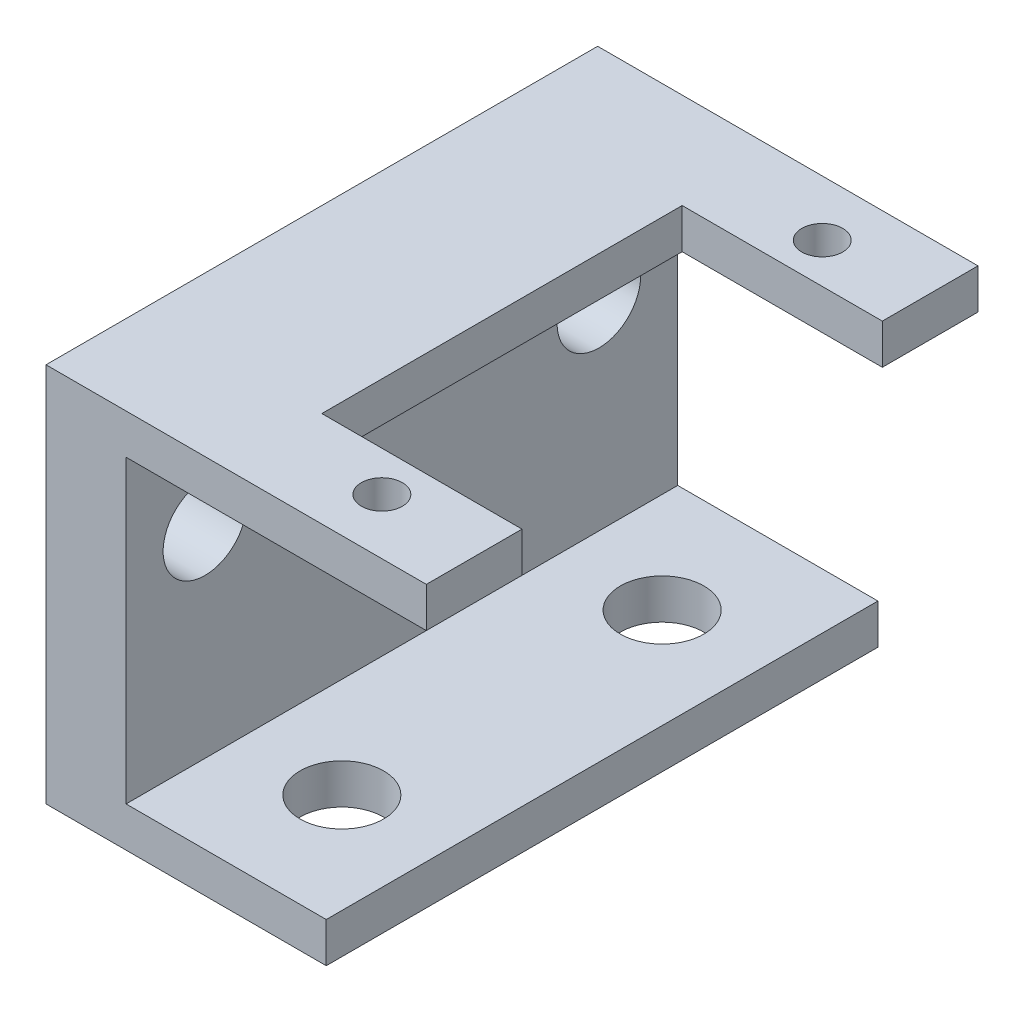
ISO-10303-21;
HEADER;
FILE_DESCRIPTION(('STEP AP214'),'2;1');
FILE_NAME('part.step','',(''),(''),'','','');
FILE_SCHEMA(('AUTOMOTIVE_DESIGN { 1 0 10303 214 1 1 1 1 }'));
ENDSEC;
DATA;
#1=APPLICATION_CONTEXT('core data for automotive mechanical design processes');
#2=APPLICATION_PROTOCOL_DEFINITION('international standard','automotive_design',2000,#1);
#3=PRODUCT_CONTEXT('',#1,'mechanical');
#4=PRODUCT('Part','Part','',(#3));
#5=PRODUCT_RELATED_PRODUCT_CATEGORY('part','',(#4));
#6=PRODUCT_DEFINITION_FORMATION('','',#4);
#7=PRODUCT_DEFINITION_CONTEXT('part definition',#1,'design');
#8=PRODUCT_DEFINITION('design','',#6,#7);
#9=PRODUCT_DEFINITION_SHAPE('','',#8);
#10=(LENGTH_UNIT() NAMED_UNIT(*) SI_UNIT(.MILLI.,.METRE.));
#11=(NAMED_UNIT(*) PLANE_ANGLE_UNIT() SI_UNIT($,.RADIAN.));
#12=(NAMED_UNIT(*) SI_UNIT($,.STERADIAN.) SOLID_ANGLE_UNIT());
#13=UNCERTAINTY_MEASURE_WITH_UNIT(LENGTH_MEASURE(1.E-05),#10,'distance_accuracy_value','');
#14=(GEOMETRIC_REPRESENTATION_CONTEXT(3) GLOBAL_UNCERTAINTY_ASSIGNED_CONTEXT((#13)) GLOBAL_UNIT_ASSIGNED_CONTEXT((#10,
#11,#12)) REPRESENTATION_CONTEXT('',''));
#15=CARTESIAN_POINT('',(0.,0.,0.));
#16=DIRECTION('',(0.,0.,1.));
#17=DIRECTION('',(1.,0.,0.));
#18=AXIS2_PLACEMENT_3D('',#15,#16,#17);
#19=CARTESIAN_POINT('',(24.13,0.,35.));
#20=DIRECTION('',(-1.,0.,0.));
#21=DIRECTION('',(0.,0.,1.));
#22=AXIS2_PLACEMENT_3D('',#19,#20,#21);
#23=PLANE('',#22);
#24=DIRECTION('',(0.,1.,0.));
#25=VECTOR('',#24,1.);
#26=CARTESIAN_POINT('',(24.13,-0.001000000000001,28.93));
#27=LINE('',#26,#25);
#28=CARTESIAN_POINT('',(24.13,21.59,28.93));
#29=VERTEX_POINT('',#28);
#30=CARTESIAN_POINT('',(24.13,24.13,28.93));
#31=VERTEX_POINT('',#30);
#32=EDGE_CURVE('E51',#29,#31,#27,.T.);
#33=ORIENTED_EDGE('',*,*,#32,.T.);
#34=DIRECTION('',(0.,0.,-1.));
#35=VECTOR('',#34,1.);
#36=CARTESIAN_POINT('',(24.13,24.13,35.));
#37=LINE('',#36,#35);
#38=CARTESIAN_POINT('',(24.13,24.13,35.));
#39=VERTEX_POINT('',#38);
#40=EDGE_CURVE('E171',#39,#31,#37,.T.);
#41=ORIENTED_EDGE('',*,*,#40,.F.);
#42=DIRECTION('',(0.,1.,0.));
#43=VECTOR('',#42,1.);
#44=CARTESIAN_POINT('',(24.13,0.,35.));
#45=LINE('',#44,#43);
#46=CARTESIAN_POINT('',(24.13,21.59,35.));
#47=VERTEX_POINT('',#46);
#48=EDGE_CURVE('E153',#47,#39,#45,.T.);
#49=ORIENTED_EDGE('',*,*,#48,.F.);
#50=DIRECTION('',(0.,0.,-1.));
#51=VECTOR('',#50,1.);
#52=CARTESIAN_POINT('',(24.13,21.59,35.));
#53=LINE('',#52,#51);
#54=EDGE_CURVE('E43',#47,#29,#53,.T.);
#55=ORIENTED_EDGE('',*,*,#54,.T.);
#56=EDGE_LOOP('',(#33,#41,#49,#55));
#57=FACE_BOUND('',#56,.T.);
#58=ADVANCED_FACE('F34',(#57),#23,.F.);
#59=CARTESIAN_POINT('',(0.,24.13,35.));
#60=DIRECTION('',(0.,1.,0.));
#61=DIRECTION('',(0.,0.,1.));
#62=AXIS2_PLACEMENT_3D('',#59,#60,#61);
#63=PLANE('',#62);
#64=CARTESIAN_POINT('',(17.78,24.13,31.47));
#65=DIRECTION('',(0.,1.,0.));
#66=DIRECTION('',(0.,0.,1.));
#67=AXIS2_PLACEMENT_3D('',#64,#65,#66);
#68=CIRCLE('',#67,1.3);
#69=CARTESIAN_POINT('',(17.78,24.13,32.77));
#70=VERTEX_POINT('',#69);
#71=EDGE_CURVE('E373',#70,#70,#68,.T.);
#72=ORIENTED_EDGE('',*,*,#71,.F.);
#73=EDGE_LOOP('',(#72));
#74=FACE_BOUND('',#73,.T.);
#75=CARTESIAN_POINT('',(17.78,24.13,3.53));
#76=DIRECTION('',(0.,1.,0.));
#77=DIRECTION('',(0.,0.,1.));
#78=AXIS2_PLACEMENT_3D('',#75,#76,#77);
#79=CIRCLE('',#78,1.3);
#80=CARTESIAN_POINT('',(17.78,24.13,4.83));
#81=VERTEX_POINT('',#80);
#82=EDGE_CURVE('E242',#81,#81,#79,.T.);
#83=ORIENTED_EDGE('',*,*,#82,.F.);
#84=EDGE_LOOP('',(#83));
#85=FACE_BOUND('',#84,.T.);
#86=DIRECTION('',(-1.,0.,0.));
#87=VECTOR('',#86,1.);
#88=CARTESIAN_POINT('',(24.13,24.13,6.07));
#89=LINE('',#88,#87);
#90=CARTESIAN_POINT('',(24.13,24.13,6.07));
#91=VERTEX_POINT('',#90);
#92=CARTESIAN_POINT('',(11.43,24.13,6.07));
#93=VERTEX_POINT('',#92);
#94=EDGE_CURVE('E235',#91,#93,#89,.T.);
#95=ORIENTED_EDGE('',*,*,#94,.F.);
#96=CARTESIAN_POINT('',(24.13,24.13,0.));
#97=VERTEX_POINT('',#96);
#98=EDGE_CURVE('E170',#91,#97,#37,.T.);
#99=ORIENTED_EDGE('',*,*,#98,.T.);
#100=DIRECTION('',(1.,0.,0.));
#101=VECTOR('',#100,1.);
#102=CARTESIAN_POINT('',(0.,24.13,0.));
#103=LINE('',#102,#101);
#104=CARTESIAN_POINT('',(0.,24.13,0.));
#105=VERTEX_POINT('',#104);
#106=EDGE_CURVE('E106',#105,#97,#103,.T.);
#107=ORIENTED_EDGE('',*,*,#106,.F.);
#108=DIRECTION('',(0.,0.,-1.));
#109=VECTOR('',#108,1.);
#110=CARTESIAN_POINT('',(0.,24.13,35.));
#111=LINE('',#110,#109);
#112=CARTESIAN_POINT('',(0.,24.13,35.));
#113=VERTEX_POINT('',#112);
#114=EDGE_CURVE('E100',#113,#105,#111,.T.);
#115=ORIENTED_EDGE('',*,*,#114,.F.);
#116=DIRECTION('',(1.,0.,0.));
#117=VECTOR('',#116,1.);
#118=CARTESIAN_POINT('',(0.,24.13,35.));
#119=LINE('',#118,#117);
#120=EDGE_CURVE('E156',#113,#39,#119,.T.);
#121=ORIENTED_EDGE('',*,*,#120,.T.);
#122=ORIENTED_EDGE('',*,*,#40,.T.);
#123=DIRECTION('',(-1.,0.,0.));
#124=VECTOR('',#123,1.);
#125=CARTESIAN_POINT('',(24.13,24.13,28.93));
#126=LINE('',#125,#124);
#127=CARTESIAN_POINT('',(11.43,24.13,28.93));
#128=VERTEX_POINT('',#127);
#129=EDGE_CURVE('E247',#31,#128,#126,.T.);
#130=ORIENTED_EDGE('',*,*,#129,.T.);
#131=DIRECTION('',(0.,0.,1.));
#132=VECTOR('',#131,1.);
#133=CARTESIAN_POINT('',(11.43,24.13,6.07));
#134=LINE('',#133,#132);
#135=EDGE_CURVE('E250',#93,#128,#134,.T.);
#136=ORIENTED_EDGE('',*,*,#135,.F.);
#137=EDGE_LOOP('',(#95,#99,#107,#115,#121,#122,#130,#136));
#138=FACE_BOUND('',#137,.T.);
#139=ADVANCED_FACE('F296',(#74,#85,#138),#63,.T.);
#140=ORIENTED_EDGE('',*,*,#98,.F.);
#141=DIRECTION('',(0.,1.,0.));
#142=VECTOR('',#141,1.);
#143=CARTESIAN_POINT('',(24.13,-0.001000000000001,6.07));
#144=LINE('',#143,#142);
#145=CARTESIAN_POINT('',(24.13,21.59,6.07));
#146=VERTEX_POINT('',#145);
#147=EDGE_CURVE('E237',#146,#91,#144,.T.);
#148=ORIENTED_EDGE('',*,*,#147,.F.);
#149=CARTESIAN_POINT('',(24.13,21.59,0.));
#150=VERTEX_POINT('',#149);
#151=EDGE_CURVE('E174',#146,#150,#53,.T.);
#152=ORIENTED_EDGE('',*,*,#151,.T.);
#153=DIRECTION('',(0.,1.,0.));
#154=VECTOR('',#153,1.);
#155=CARTESIAN_POINT('',(24.13,0.,0.));
#156=LINE('',#155,#154);
#157=EDGE_CURVE('E164',#150,#97,#156,.T.);
#158=ORIENTED_EDGE('',*,*,#157,.T.);
#159=EDGE_LOOP('',(#140,#148,#152,#158));
#160=FACE_BOUND('',#159,.T.);
#161=ADVANCED_FACE('F299',(#160),#23,.F.);
#162=CARTESIAN_POINT('',(0.,0.,0.));
#163=DIRECTION('',(0.,0.,1.));
#164=DIRECTION('',(1.,0.,0.));
#165=AXIS2_PLACEMENT_3D('',#162,#163,#164);
#166=PLANE('',#165);
#167=DIRECTION('',(1.,0.,0.));
#168=VECTOR('',#167,1.);
#169=CARTESIAN_POINT('',(0.,21.59,0.));
#170=LINE('',#169,#168);
#171=CARTESIAN_POINT('',(5.08,21.59,0.));
#172=VERTEX_POINT('',#171);
#173=EDGE_CURVE('E161',#172,#150,#170,.T.);
#174=ORIENTED_EDGE('',*,*,#173,.F.);
#175=DIRECTION('',(0.,1.,0.));
#176=VECTOR('',#175,1.);
#177=CARTESIAN_POINT('',(5.08,2.54,0.));
#178=LINE('',#177,#176);
#179=CARTESIAN_POINT('',(5.08,2.54,0.));
#180=VERTEX_POINT('',#179);
#181=EDGE_CURVE('E114',#180,#172,#178,.T.);
#182=ORIENTED_EDGE('',*,*,#181,.F.);
#183=DIRECTION('',(1.,0.,0.));
#184=VECTOR('',#183,1.);
#185=CARTESIAN_POINT('',(0.,2.54,0.));
#186=LINE('',#185,#184);
#187=CARTESIAN_POINT('',(17.78,2.54,0.));
#188=VERTEX_POINT('',#187);
#189=EDGE_CURVE('E126',#180,#188,#186,.T.);
#190=ORIENTED_EDGE('',*,*,#189,.T.);
#191=DIRECTION('',(0.,1.,0.));
#192=VECTOR('',#191,1.);
#193=CARTESIAN_POINT('',(17.78,0.,0.));
#194=LINE('',#193,#192);
#195=CARTESIAN_POINT('',(17.78,0.,0.));
#196=VERTEX_POINT('',#195);
#197=EDGE_CURVE('E121',#196,#188,#194,.T.);
#198=ORIENTED_EDGE('',*,*,#197,.F.);
#199=DIRECTION('',(1.,0.,0.));
#200=VECTOR('',#199,1.);
#201=CARTESIAN_POINT('',(0.,0.,0.));
#202=LINE('',#201,#200);
#203=CARTESIAN_POINT('',(0.,0.,0.));
#204=VERTEX_POINT('',#203);
#205=EDGE_CURVE('E111',#204,#196,#202,.T.);
#206=ORIENTED_EDGE('',*,*,#205,.F.);
#207=DIRECTION('',(0.,1.,0.));
#208=VECTOR('',#207,1.);
#209=CARTESIAN_POINT('',(0.,0.,0.));
#210=LINE('',#209,#208);
#211=EDGE_CURVE('E92',#204,#105,#210,.T.);
#212=ORIENTED_EDGE('',*,*,#211,.T.);
#213=ORIENTED_EDGE('',*,*,#106,.T.);
#214=ORIENTED_EDGE('',*,*,#157,.F.);
#215=EDGE_LOOP('',(#174,#182,#190,#198,#206,#212,#213,#214));
#216=FACE_BOUND('',#215,.T.);
#217=ADVANCED_FACE('F119',(#216),#166,.F.);
#218=CARTESIAN_POINT('',(0.,0.,35.));
#219=DIRECTION('',(0.,0.,1.));
#220=DIRECTION('',(1.,0.,0.));
#221=AXIS2_PLACEMENT_3D('',#218,#219,#220);
#222=PLANE('',#221);
#223=DIRECTION('',(0.,1.,0.));
#224=VECTOR('',#223,1.);
#225=CARTESIAN_POINT('',(0.,0.,35.));
#226=LINE('',#225,#224);
#227=CARTESIAN_POINT('',(0.,0.,35.));
#228=VERTEX_POINT('',#227);
#229=EDGE_CURVE('E159',#228,#113,#226,.T.);
#230=ORIENTED_EDGE('',*,*,#229,.F.);
#231=DIRECTION('',(1.,0.,0.));
#232=VECTOR('',#231,1.);
#233=CARTESIAN_POINT('',(0.,0.,35.));
#234=LINE('',#233,#232);
#235=CARTESIAN_POINT('',(17.78,0.,35.));
#236=VERTEX_POINT('',#235);
#237=EDGE_CURVE('E113',#228,#236,#234,.T.);
#238=ORIENTED_EDGE('',*,*,#237,.T.);
#239=DIRECTION('',(0.,1.,0.));
#240=VECTOR('',#239,1.);
#241=CARTESIAN_POINT('',(17.78,0.,35.));
#242=LINE('',#241,#240);
#243=CARTESIAN_POINT('',(17.78,2.54,35.));
#244=VERTEX_POINT('',#243);
#245=EDGE_CURVE('E124',#236,#244,#242,.T.);
#246=ORIENTED_EDGE('',*,*,#245,.T.);
#247=DIRECTION('',(1.,0.,0.));
#248=VECTOR('',#247,1.);
#249=CARTESIAN_POINT('',(0.,2.54,35.));
#250=LINE('',#249,#248);
#251=CARTESIAN_POINT('',(5.08,2.54,35.));
#252=VERTEX_POINT('',#251);
#253=EDGE_CURVE('E122',#252,#244,#250,.T.);
#254=ORIENTED_EDGE('',*,*,#253,.F.);
#255=DIRECTION('',(0.,1.,0.));
#256=VECTOR('',#255,1.);
#257=CARTESIAN_POINT('',(5.08,2.54,35.));
#258=LINE('',#257,#256);
#259=CARTESIAN_POINT('',(5.08,21.59,35.));
#260=VERTEX_POINT('',#259);
#261=EDGE_CURVE('E177',#252,#260,#258,.T.);
#262=ORIENTED_EDGE('',*,*,#261,.T.);
#263=DIRECTION('',(1.,0.,0.));
#264=VECTOR('',#263,1.);
#265=CARTESIAN_POINT('',(0.,21.59,35.));
#266=LINE('',#265,#264);
#267=EDGE_CURVE('E105',#260,#47,#266,.T.);
#268=ORIENTED_EDGE('',*,*,#267,.T.);
#269=ORIENTED_EDGE('',*,*,#48,.T.);
#270=ORIENTED_EDGE('',*,*,#120,.F.);
#271=EDGE_LOOP('',(#230,#238,#246,#254,#262,#268,#269,#270));
#272=FACE_BOUND('',#271,.T.);
#273=ADVANCED_FACE('F310',(#272),#222,.T.);
#274=CARTESIAN_POINT('',(0.,21.59,35.));
#275=DIRECTION('',(0.,1.,0.));
#276=DIRECTION('',(0.,0.,1.));
#277=AXIS2_PLACEMENT_3D('',#274,#275,#276);
#278=PLANE('',#277);
#279=CARTESIAN_POINT('',(17.78,21.59,31.47));
#280=DIRECTION('',(0.,1.,0.));
#281=DIRECTION('',(0.,0.,1.));
#282=AXIS2_PLACEMENT_3D('',#279,#280,#281);
#283=CIRCLE('',#282,1.3);
#284=CARTESIAN_POINT('',(17.78,21.59,32.77));
#285=VERTEX_POINT('',#284);
#286=EDGE_CURVE('E370',#285,#285,#283,.T.);
#287=ORIENTED_EDGE('',*,*,#286,.T.);
#288=EDGE_LOOP('',(#287));
#289=FACE_BOUND('',#288,.T.);
#290=CARTESIAN_POINT('',(17.78,21.59,3.53));
#291=DIRECTION('',(0.,1.,0.));
#292=DIRECTION('',(0.,0.,1.));
#293=AXIS2_PLACEMENT_3D('',#290,#291,#292);
#294=CIRCLE('',#293,1.3);
#295=CARTESIAN_POINT('',(17.78,21.59,4.83));
#296=VERTEX_POINT('',#295);
#297=EDGE_CURVE('E239',#296,#296,#294,.T.);
#298=ORIENTED_EDGE('',*,*,#297,.T.);
#299=EDGE_LOOP('',(#298));
#300=FACE_BOUND('',#299,.T.);
#301=ORIENTED_EDGE('',*,*,#151,.F.);
#302=DIRECTION('',(1.,0.,0.));
#303=VECTOR('',#302,1.);
#304=CARTESIAN_POINT('',(24.13,21.59,6.07));
#305=LINE('',#304,#303);
#306=CARTESIAN_POINT('',(11.43,21.59,6.07));
#307=VERTEX_POINT('',#306);
#308=EDGE_CURVE('E230',#307,#146,#305,.T.);
#309=ORIENTED_EDGE('',*,*,#308,.F.);
#310=DIRECTION('',(0.,0.,-1.));
#311=VECTOR('',#310,1.);
#312=CARTESIAN_POINT('',(11.43,21.59,6.07));
#313=LINE('',#312,#311);
#314=CARTESIAN_POINT('',(11.43,21.59,28.93));
#315=VERTEX_POINT('',#314);
#316=EDGE_CURVE('E222',#315,#307,#313,.T.);
#317=ORIENTED_EDGE('',*,*,#316,.F.);
#318=DIRECTION('',(1.,0.,0.));
#319=VECTOR('',#318,1.);
#320=CARTESIAN_POINT('',(24.13,21.59,28.93));
#321=LINE('',#320,#319);
#322=EDGE_CURVE('E229',#315,#29,#321,.T.);
#323=ORIENTED_EDGE('',*,*,#322,.T.);
#324=ORIENTED_EDGE('',*,*,#54,.F.);
#325=ORIENTED_EDGE('',*,*,#267,.F.);
#326=DIRECTION('',(0.,0.,-1.));
#327=VECTOR('',#326,1.);
#328=CARTESIAN_POINT('',(5.08,21.59,35.));
#329=LINE('',#328,#327);
#330=EDGE_CURVE('E11',#260,#172,#329,.T.);
#331=ORIENTED_EDGE('',*,*,#330,.T.);
#332=ORIENTED_EDGE('',*,*,#173,.T.);
#333=EDGE_LOOP('',(#301,#309,#317,#323,#324,#325,#331,#332));
#334=FACE_BOUND('',#333,.T.);
#335=ADVANCED_FACE('F185',(#289,#300,#334),#278,.F.);
#336=CARTESIAN_POINT('',(0.,0.,35.));
#337=DIRECTION('',(-1.,0.,0.));
#338=DIRECTION('',(0.,-1.,0.));
#339=AXIS2_PLACEMENT_3D('',#336,#337,#338);
#340=PLANE('',#339);
#341=CARTESIAN_POINT('',(0.,15.24,30.));
#342=DIRECTION('',(1.,0.,0.));
#343=DIRECTION('',(0.,0.,-1.));
#344=AXIS2_PLACEMENT_3D('',#341,#342,#343);
#345=CIRCLE('',#344,2.65);
#346=CARTESIAN_POINT('',(0.,15.24,27.35));
#347=VERTEX_POINT('',#346);
#348=EDGE_CURVE('E147',#347,#347,#345,.T.);
#349=ORIENTED_EDGE('',*,*,#348,.T.);
#350=EDGE_LOOP('',(#349));
#351=FACE_BOUND('',#350,.T.);
#352=CARTESIAN_POINT('',(0.,15.24,5.));
#353=DIRECTION('',(1.,0.,0.));
#354=DIRECTION('',(0.,0.,-1.));
#355=AXIS2_PLACEMENT_3D('',#352,#353,#354);
#356=CIRCLE('',#355,2.65);
#357=CARTESIAN_POINT('',(0.,15.24,2.35000000000001));
#358=VERTEX_POINT('',#357);
#359=EDGE_CURVE('E139',#358,#358,#356,.T.);
#360=ORIENTED_EDGE('',*,*,#359,.T.);
#361=EDGE_LOOP('',(#360));
#362=FACE_BOUND('',#361,.T.);
#363=ORIENTED_EDGE('',*,*,#211,.F.);
#364=DIRECTION('',(0.,0.,-1.));
#365=VECTOR('',#364,1.);
#366=CARTESIAN_POINT('',(0.,0.,35.));
#367=LINE('',#366,#365);
#368=EDGE_CURVE('E96',#228,#204,#367,.T.);
#369=ORIENTED_EDGE('',*,*,#368,.F.);
#370=ORIENTED_EDGE('',*,*,#229,.T.);
#371=ORIENTED_EDGE('',*,*,#114,.T.);
#372=EDGE_LOOP('',(#363,#369,#370,#371));
#373=FACE_BOUND('',#372,.T.);
#374=ADVANCED_FACE('F94',(#351,#362,#373),#340,.T.);
#375=CARTESIAN_POINT('',(0.,0.,35.));
#376=DIRECTION('',(0.,1.,0.));
#377=DIRECTION('',(0.,0.,1.));
#378=AXIS2_PLACEMENT_3D('',#375,#376,#377);
#379=PLANE('',#378);
#380=CARTESIAN_POINT('',(11.43,0.,27.66));
#381=DIRECTION('',(0.,1.,0.));
#382=DIRECTION('',(0.,0.,1.));
#383=AXIS2_PLACEMENT_3D('',#380,#381,#382);
#384=CIRCLE('',#383,2.65);
#385=CARTESIAN_POINT('',(11.43,0.,30.31));
#386=VERTEX_POINT('',#385);
#387=EDGE_CURVE('E259',#386,#386,#384,.T.);
#388=ORIENTED_EDGE('',*,*,#387,.T.);
#389=EDGE_LOOP('',(#388));
#390=FACE_BOUND('',#389,.T.);
#391=CARTESIAN_POINT('',(11.43,0.,7.34));
#392=DIRECTION('',(0.,1.,0.));
#393=DIRECTION('',(0.,0.,1.));
#394=AXIS2_PLACEMENT_3D('',#391,#392,#393);
#395=CIRCLE('',#394,2.65);
#396=CARTESIAN_POINT('',(11.43,0.,9.99));
#397=VERTEX_POINT('',#396);
#398=EDGE_CURVE('E265',#397,#397,#395,.T.);
#399=ORIENTED_EDGE('',*,*,#398,.T.);
#400=EDGE_LOOP('',(#399));
#401=FACE_BOUND('',#400,.T.);
#402=ORIENTED_EDGE('',*,*,#205,.T.);
#403=DIRECTION('',(0.,0.,-1.));
#404=VECTOR('',#403,1.);
#405=CARTESIAN_POINT('',(17.78,0.,35.));
#406=LINE('',#405,#404);
#407=EDGE_CURVE('E115',#236,#196,#406,.T.);
#408=ORIENTED_EDGE('',*,*,#407,.F.);
#409=ORIENTED_EDGE('',*,*,#237,.F.);
#410=ORIENTED_EDGE('',*,*,#368,.T.);
#411=EDGE_LOOP('',(#402,#408,#409,#410));
#412=FACE_BOUND('',#411,.T.);
#413=ADVANCED_FACE('F109',(#390,#401,#412),#379,.F.);
#414=CARTESIAN_POINT('',(17.78,0.,35.));
#415=DIRECTION('',(-1.,0.,0.));
#416=DIRECTION('',(0.,0.,1.));
#417=AXIS2_PLACEMENT_3D('',#414,#415,#416);
#418=PLANE('',#417);
#419=ORIENTED_EDGE('',*,*,#197,.T.);
#420=DIRECTION('',(0.,0.,-1.));
#421=VECTOR('',#420,1.);
#422=CARTESIAN_POINT('',(17.78,2.54,35.));
#423=LINE('',#422,#421);
#424=EDGE_CURVE('E38',#244,#188,#423,.T.);
#425=ORIENTED_EDGE('',*,*,#424,.F.);
#426=ORIENTED_EDGE('',*,*,#245,.F.);
#427=ORIENTED_EDGE('',*,*,#407,.T.);
#428=EDGE_LOOP('',(#419,#425,#426,#427));
#429=FACE_BOUND('',#428,.T.);
#430=ADVANCED_FACE('F290',(#429),#418,.F.);
#431=CARTESIAN_POINT('',(0.,2.54,35.));
#432=DIRECTION('',(0.,1.,0.));
#433=DIRECTION('',(0.,0.,1.));
#434=AXIS2_PLACEMENT_3D('',#431,#432,#433);
#435=PLANE('',#434);
#436=CARTESIAN_POINT('',(11.43,2.54,27.66));
#437=DIRECTION('',(0.,1.,0.));
#438=DIRECTION('',(0.,0.,1.));
#439=AXIS2_PLACEMENT_3D('',#436,#437,#438);
#440=CIRCLE('',#439,2.64999999999999);
#441=CARTESIAN_POINT('',(11.43,2.54,30.31));
#442=VERTEX_POINT('',#441);
#443=EDGE_CURVE('E256',#442,#442,#440,.T.);
#444=ORIENTED_EDGE('',*,*,#443,.F.);
#445=EDGE_LOOP('',(#444));
#446=FACE_BOUND('',#445,.T.);
#447=CARTESIAN_POINT('',(11.43,2.54,7.34));
#448=DIRECTION('',(0.,1.,0.));
#449=DIRECTION('',(0.,0.,1.));
#450=AXIS2_PLACEMENT_3D('',#447,#448,#449);
#451=CIRCLE('',#450,2.64999999999999);
#452=CARTESIAN_POINT('',(11.43,2.54,9.98999999999999));
#453=VERTEX_POINT('',#452);
#454=EDGE_CURVE('E262',#453,#453,#451,.T.);
#455=ORIENTED_EDGE('',*,*,#454,.F.);
#456=EDGE_LOOP('',(#455));
#457=FACE_BOUND('',#456,.T.);
#458=DIRECTION('',(0.,0.,-1.));
#459=VECTOR('',#458,1.);
#460=CARTESIAN_POINT('',(5.08,2.54,35.));
#461=LINE('',#460,#459);
#462=EDGE_CURVE('E165',#252,#180,#461,.T.);
#463=ORIENTED_EDGE('',*,*,#462,.F.);
#464=ORIENTED_EDGE('',*,*,#253,.T.);
#465=ORIENTED_EDGE('',*,*,#424,.T.);
#466=ORIENTED_EDGE('',*,*,#189,.F.);
#467=EDGE_LOOP('',(#463,#464,#465,#466));
#468=FACE_BOUND('',#467,.T.);
#469=ADVANCED_FACE('F36',(#446,#457,#468),#435,.T.);
#470=CARTESIAN_POINT('',(5.08,2.54,35.));
#471=DIRECTION('',(-1.,0.,0.));
#472=DIRECTION('',(0.,-1.,0.));
#473=AXIS2_PLACEMENT_3D('',#470,#471,#472);
#474=PLANE('',#473);
#475=CARTESIAN_POINT('',(5.08,15.24,30.));
#476=DIRECTION('',(1.,0.,0.));
#477=DIRECTION('',(0.,0.,-1.));
#478=AXIS2_PLACEMENT_3D('',#475,#476,#477);
#479=CIRCLE('',#478,2.65);
#480=CARTESIAN_POINT('',(5.08,15.24,27.35));
#481=VERTEX_POINT('',#480);
#482=EDGE_CURVE('E268',#481,#481,#479,.T.);
#483=ORIENTED_EDGE('',*,*,#482,.F.);
#484=EDGE_LOOP('',(#483));
#485=FACE_BOUND('',#484,.T.);
#486=CARTESIAN_POINT('',(5.08,15.24,5.));
#487=DIRECTION('',(1.,0.,0.));
#488=DIRECTION('',(0.,0.,-1.));
#489=AXIS2_PLACEMENT_3D('',#486,#487,#488);
#490=CIRCLE('',#489,2.65);
#491=CARTESIAN_POINT('',(5.08,15.24,2.35000000000001));
#492=VERTEX_POINT('',#491);
#493=EDGE_CURVE('E142',#492,#492,#490,.T.);
#494=ORIENTED_EDGE('',*,*,#493,.F.);
#495=EDGE_LOOP('',(#494));
#496=FACE_BOUND('',#495,.T.);
#497=ORIENTED_EDGE('',*,*,#181,.T.);
#498=ORIENTED_EDGE('',*,*,#330,.F.);
#499=ORIENTED_EDGE('',*,*,#261,.F.);
#500=ORIENTED_EDGE('',*,*,#462,.T.);
#501=EDGE_LOOP('',(#497,#498,#499,#500));
#502=FACE_BOUND('',#501,.T.);
#503=ADVANCED_FACE('F180',(#485,#496,#502),#474,.F.);
#504=CARTESIAN_POINT('',(5.08,15.24,5.));
#505=DIRECTION('',(1.,0.,0.));
#506=DIRECTION('',(0.,0.,-1.));
#507=AXIS2_PLACEMENT_3D('',#504,#505,#506);
#508=CYLINDRICAL_SURFACE('',#507,2.65);
#509=ORIENTED_EDGE('',*,*,#359,.F.);
#510=EDGE_LOOP('',(#509));
#511=FACE_BOUND('',#510,.T.);
#512=ORIENTED_EDGE('',*,*,#493,.T.);
#513=EDGE_LOOP('',(#512));
#514=FACE_BOUND('',#513,.T.);
#515=ADVANCED_FACE('F278',(#511,#514),#508,.F.);
#516=CARTESIAN_POINT('',(5.08,15.24,30.));
#517=DIRECTION('',(1.,0.,0.));
#518=DIRECTION('',(0.,0.,-1.));
#519=AXIS2_PLACEMENT_3D('',#516,#517,#518);
#520=CYLINDRICAL_SURFACE('',#519,2.65);
#521=ORIENTED_EDGE('',*,*,#348,.F.);
#522=EDGE_LOOP('',(#521));
#523=FACE_BOUND('',#522,.T.);
#524=ORIENTED_EDGE('',*,*,#482,.T.);
#525=EDGE_LOOP('',(#524));
#526=FACE_BOUND('',#525,.T.);
#527=ADVANCED_FACE('F274',(#523,#526),#520,.F.);
#528=CARTESIAN_POINT('',(11.43,2.54,7.34));
#529=DIRECTION('',(0.,1.,0.));
#530=DIRECTION('',(0.,0.,1.));
#531=AXIS2_PLACEMENT_3D('',#528,#529,#530);
#532=CYLINDRICAL_SURFACE('',#531,2.64999999999999);
#533=ORIENTED_EDGE('',*,*,#398,.F.);
#534=EDGE_LOOP('',(#533));
#535=FACE_BOUND('',#534,.T.);
#536=ORIENTED_EDGE('',*,*,#454,.T.);
#537=EDGE_LOOP('',(#536));
#538=FACE_BOUND('',#537,.T.);
#539=ADVANCED_FACE('F277',(#535,#538),#532,.F.);
#540=CARTESIAN_POINT('',(11.43,2.54,27.66));
#541=DIRECTION('',(0.,1.,0.));
#542=DIRECTION('',(0.,0.,1.));
#543=AXIS2_PLACEMENT_3D('',#540,#541,#542);
#544=CYLINDRICAL_SURFACE('',#543,2.64999999999999);
#545=ORIENTED_EDGE('',*,*,#387,.F.);
#546=EDGE_LOOP('',(#545));
#547=FACE_BOUND('',#546,.T.);
#548=ORIENTED_EDGE('',*,*,#443,.T.);
#549=EDGE_LOOP('',(#548));
#550=FACE_BOUND('',#549,.T.);
#551=ADVANCED_FACE('F342',(#547,#550),#544,.F.);
#552=CARTESIAN_POINT('',(24.13,-0.001000000000001,6.07));
#553=DIRECTION('',(0.,0.,-1.));
#554=DIRECTION('',(-1.,0.,0.));
#555=AXIS2_PLACEMENT_3D('',#552,#553,#554);
#556=PLANE('',#555);
#557=ORIENTED_EDGE('',*,*,#308,.T.);
#558=ORIENTED_EDGE('',*,*,#147,.T.);
#559=ORIENTED_EDGE('',*,*,#94,.T.);
#560=DIRECTION('',(0.,1.,0.));
#561=VECTOR('',#560,1.);
#562=CARTESIAN_POINT('',(11.43,-0.001000000000001,6.07));
#563=LINE('',#562,#561);
#564=EDGE_CURVE('E226',#307,#93,#563,.T.);
#565=ORIENTED_EDGE('',*,*,#564,.F.);
#566=EDGE_LOOP('',(#557,#558,#559,#565));
#567=FACE_BOUND('',#566,.T.);
#568=ADVANCED_FACE('F233',(#567),#556,.F.);
#569=CARTESIAN_POINT('',(11.43,-0.001000000000001,6.07));
#570=DIRECTION('',(-1.,0.,0.));
#571=DIRECTION('',(0.,0.,1.));
#572=AXIS2_PLACEMENT_3D('',#569,#570,#571);
#573=PLANE('',#572);
#574=ORIENTED_EDGE('',*,*,#316,.T.);
#575=ORIENTED_EDGE('',*,*,#564,.T.);
#576=ORIENTED_EDGE('',*,*,#135,.T.);
#577=DIRECTION('',(0.,1.,0.));
#578=VECTOR('',#577,1.);
#579=CARTESIAN_POINT('',(11.43,-0.001000000000001,28.93));
#580=LINE('',#579,#578);
#581=EDGE_CURVE('E228',#315,#128,#580,.T.);
#582=ORIENTED_EDGE('',*,*,#581,.F.);
#583=EDGE_LOOP('',(#574,#575,#576,#582));
#584=FACE_BOUND('',#583,.T.);
#585=ADVANCED_FACE('F224',(#584),#573,.F.);
#586=CARTESIAN_POINT('',(24.13,-0.001000000000001,28.93));
#587=DIRECTION('',(0.,0.,-1.));
#588=DIRECTION('',(-1.,0.,0.));
#589=AXIS2_PLACEMENT_3D('',#586,#587,#588);
#590=PLANE('',#589);
#591=ORIENTED_EDGE('',*,*,#581,.T.);
#592=ORIENTED_EDGE('',*,*,#129,.F.);
#593=ORIENTED_EDGE('',*,*,#32,.F.);
#594=ORIENTED_EDGE('',*,*,#322,.F.);
#595=EDGE_LOOP('',(#591,#592,#593,#594));
#596=FACE_BOUND('',#595,.T.);
#597=ADVANCED_FACE('F315',(#596),#590,.T.);
#598=CARTESIAN_POINT('',(17.78,24.13,3.53));
#599=DIRECTION('',(0.,1.,0.));
#600=DIRECTION('',(0.,0.,1.));
#601=AXIS2_PLACEMENT_3D('',#598,#599,#600);
#602=CYLINDRICAL_SURFACE('',#601,1.3);
#603=ORIENTED_EDGE('',*,*,#297,.F.);
#604=EDGE_LOOP('',(#603));
#605=FACE_BOUND('',#604,.T.);
#606=ORIENTED_EDGE('',*,*,#82,.T.);
#607=EDGE_LOOP('',(#606));
#608=FACE_BOUND('',#607,.T.);
#609=ADVANCED_FACE('F354',(#605,#608),#602,.F.);
#610=CARTESIAN_POINT('',(17.78,24.13,31.47));
#611=DIRECTION('',(0.,1.,0.));
#612=DIRECTION('',(0.,0.,1.));
#613=AXIS2_PLACEMENT_3D('',#610,#611,#612);
#614=CYLINDRICAL_SURFACE('',#613,1.3);
#615=ORIENTED_EDGE('',*,*,#286,.F.);
#616=EDGE_LOOP('',(#615));
#617=FACE_BOUND('',#616,.T.);
#618=ORIENTED_EDGE('',*,*,#71,.T.);
#619=EDGE_LOOP('',(#618));
#620=FACE_BOUND('',#619,.T.);
#621=ADVANCED_FACE('F361',(#617,#620),#614,.F.);
#622=CLOSED_SHELL('',(#58,#139,#161,#217,#273,#335,#374,#413,#430,#469,#503,#515,#527,#539,#551,
#568,#585,#597,#609,#621));
#623=MANIFOLD_SOLID_BREP('B2',#622);
#624=ADVANCED_BREP_SHAPE_REPRESENTATION('',(#18,#623),#14);
#625=SHAPE_DEFINITION_REPRESENTATION(#9,#624);
ENDSEC;
END-ISO-10303-21;
